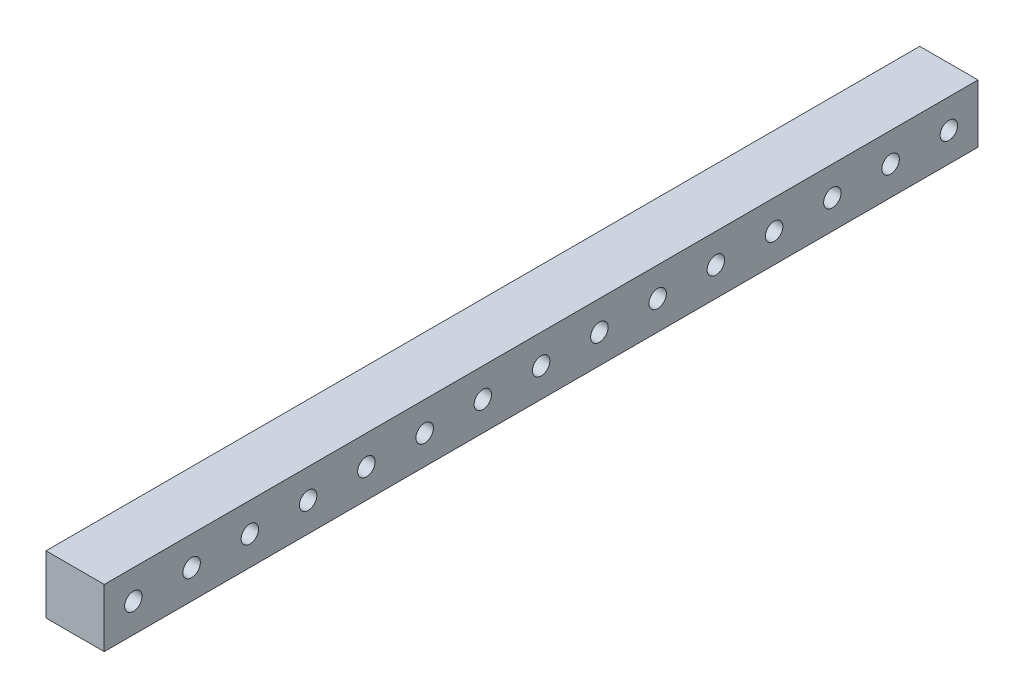
ISO-10303-21;
HEADER;
FILE_DESCRIPTION(('STEP AP214'),'2;1');
FILE_NAME('part.step','',(''),(''),'','','');
FILE_SCHEMA(('AUTOMOTIVE_DESIGN { 1 0 10303 214 1 1 1 1 }'));
ENDSEC;
DATA;
#1=APPLICATION_CONTEXT('core data for automotive mechanical design processes');
#2=APPLICATION_PROTOCOL_DEFINITION('international standard','automotive_design',2000,#1);
#3=PRODUCT_CONTEXT('',#1,'mechanical');
#4=PRODUCT('Part','Part','',(#3));
#5=PRODUCT_RELATED_PRODUCT_CATEGORY('part','',(#4));
#6=PRODUCT_DEFINITION_FORMATION('','',#4);
#7=PRODUCT_DEFINITION_CONTEXT('part definition',#1,'design');
#8=PRODUCT_DEFINITION('design','',#6,#7);
#9=PRODUCT_DEFINITION_SHAPE('','',#8);
#10=(LENGTH_UNIT() NAMED_UNIT(*) SI_UNIT(.MILLI.,.METRE.));
#11=(NAMED_UNIT(*) PLANE_ANGLE_UNIT() SI_UNIT($,.RADIAN.));
#12=(NAMED_UNIT(*) SI_UNIT($,.STERADIAN.) SOLID_ANGLE_UNIT());
#13=UNCERTAINTY_MEASURE_WITH_UNIT(LENGTH_MEASURE(1.E-05),#10,'distance_accuracy_value','');
#14=(GEOMETRIC_REPRESENTATION_CONTEXT(3) GLOBAL_UNCERTAINTY_ASSIGNED_CONTEXT((#13)) GLOBAL_UNIT_ASSIGNED_CONTEXT((#10,
#11,#12)) REPRESENTATION_CONTEXT('',''));
#15=CARTESIAN_POINT('',(0.,0.,0.));
#16=DIRECTION('',(0.,0.,1.));
#17=DIRECTION('',(1.,0.,0.));
#18=AXIS2_PLACEMENT_3D('',#15,#16,#17);
#19=CARTESIAN_POINT('',(10.,0.,290.));
#20=DIRECTION('',(1.,0.,0.));
#21=DIRECTION('',(0.,0.,-1.));
#22=AXIS2_PLACEMENT_3D('',#19,#20,#21);
#23=CYLINDRICAL_SURFACE('',#22,3.);
#24=CARTESIAN_POINT('',(-10.,0.,290.));
#25=DIRECTION('',(1.,0.,0.));
#26=DIRECTION('',(0.,0.,-1.));
#27=AXIS2_PLACEMENT_3D('',#24,#25,#26);
#28=CIRCLE('',#27,2.99999999999999);
#29=CARTESIAN_POINT('',(-10.,0.,287.));
#30=VERTEX_POINT('',#29);
#31=EDGE_CURVE('E40',#30,#30,#28,.T.);
#32=ORIENTED_EDGE('',*,*,#31,.F.);
#33=EDGE_LOOP('',(#32));
#34=FACE_BOUND('',#33,.T.);
#35=CARTESIAN_POINT('',(10.,0.,290.));
#36=DIRECTION('',(1.,0.,0.));
#37=DIRECTION('',(0.,0.,-1.));
#38=AXIS2_PLACEMENT_3D('',#35,#36,#37);
#39=CIRCLE('',#38,3.);
#40=CARTESIAN_POINT('',(10.,0.,287.));
#41=VERTEX_POINT('',#40);
#42=EDGE_CURVE('E11',#41,#41,#39,.T.);
#43=ORIENTED_EDGE('',*,*,#42,.T.);
#44=EDGE_LOOP('',(#43));
#45=FACE_BOUND('',#44,.T.);
#46=ADVANCED_FACE('F32',(#34,#45),#23,.F.);
#47=CARTESIAN_POINT('',(10.,0.,270.));
#48=DIRECTION('',(1.,0.,0.));
#49=DIRECTION('',(0.,0.,-1.));
#50=AXIS2_PLACEMENT_3D('',#47,#48,#49);
#51=CYLINDRICAL_SURFACE('',#50,3.);
#52=CARTESIAN_POINT('',(-10.,0.,270.));
#53=DIRECTION('',(1.,0.,0.));
#54=DIRECTION('',(0.,0.,-1.));
#55=AXIS2_PLACEMENT_3D('',#52,#53,#54);
#56=CIRCLE('',#55,2.99999999999999);
#57=CARTESIAN_POINT('',(-10.,0.,267.));
#58=VERTEX_POINT('',#57);
#59=EDGE_CURVE('E176',#58,#58,#56,.T.);
#60=ORIENTED_EDGE('',*,*,#59,.F.);
#61=EDGE_LOOP('',(#60));
#62=FACE_BOUND('',#61,.T.);
#63=CARTESIAN_POINT('',(10.,0.,270.));
#64=DIRECTION('',(1.,0.,0.));
#65=DIRECTION('',(0.,0.,-1.));
#66=AXIS2_PLACEMENT_3D('',#63,#64,#65);
#67=CIRCLE('',#66,3.);
#68=CARTESIAN_POINT('',(10.,0.,267.));
#69=VERTEX_POINT('',#68);
#70=EDGE_CURVE('E179',#69,#69,#67,.T.);
#71=ORIENTED_EDGE('',*,*,#70,.T.);
#72=EDGE_LOOP('',(#71));
#73=FACE_BOUND('',#72,.T.);
#74=ADVANCED_FACE('F188',(#62,#73),#51,.F.);
#75=CARTESIAN_POINT('',(10.,0.,250.));
#76=DIRECTION('',(1.,0.,0.));
#77=DIRECTION('',(0.,0.,-1.));
#78=AXIS2_PLACEMENT_3D('',#75,#76,#77);
#79=CYLINDRICAL_SURFACE('',#78,3.);
#80=CARTESIAN_POINT('',(-10.,0.,250.));
#81=DIRECTION('',(1.,0.,0.));
#82=DIRECTION('',(0.,0.,-1.));
#83=AXIS2_PLACEMENT_3D('',#80,#81,#82);
#84=CIRCLE('',#83,2.99999999999999);
#85=CARTESIAN_POINT('',(-10.,0.,247.));
#86=VERTEX_POINT('',#85);
#87=EDGE_CURVE('E170',#86,#86,#84,.T.);
#88=ORIENTED_EDGE('',*,*,#87,.F.);
#89=EDGE_LOOP('',(#88));
#90=FACE_BOUND('',#89,.T.);
#91=CARTESIAN_POINT('',(10.,0.,250.));
#92=DIRECTION('',(1.,0.,0.));
#93=DIRECTION('',(0.,0.,-1.));
#94=AXIS2_PLACEMENT_3D('',#91,#92,#93);
#95=CIRCLE('',#94,3.);
#96=CARTESIAN_POINT('',(10.,0.,247.));
#97=VERTEX_POINT('',#96);
#98=EDGE_CURVE('E173',#97,#97,#95,.T.);
#99=ORIENTED_EDGE('',*,*,#98,.T.);
#100=EDGE_LOOP('',(#99));
#101=FACE_BOUND('',#100,.T.);
#102=ADVANCED_FACE('F247',(#90,#101),#79,.F.);
#103=CARTESIAN_POINT('',(10.,0.,230.));
#104=DIRECTION('',(1.,0.,0.));
#105=DIRECTION('',(0.,0.,-1.));
#106=AXIS2_PLACEMENT_3D('',#103,#104,#105);
#107=CYLINDRICAL_SURFACE('',#106,3.);
#108=CARTESIAN_POINT('',(-10.,0.,230.));
#109=DIRECTION('',(1.,0.,0.));
#110=DIRECTION('',(0.,0.,-1.));
#111=AXIS2_PLACEMENT_3D('',#108,#109,#110);
#112=CIRCLE('',#111,2.99999999999999);
#113=CARTESIAN_POINT('',(-10.,0.,227.));
#114=VERTEX_POINT('',#113);
#115=EDGE_CURVE('E164',#114,#114,#112,.T.);
#116=ORIENTED_EDGE('',*,*,#115,.F.);
#117=EDGE_LOOP('',(#116));
#118=FACE_BOUND('',#117,.T.);
#119=CARTESIAN_POINT('',(10.,0.,230.));
#120=DIRECTION('',(1.,0.,0.));
#121=DIRECTION('',(0.,0.,-1.));
#122=AXIS2_PLACEMENT_3D('',#119,#120,#121);
#123=CIRCLE('',#122,3.);
#124=CARTESIAN_POINT('',(10.,0.,227.));
#125=VERTEX_POINT('',#124);
#126=EDGE_CURVE('E167',#125,#125,#123,.T.);
#127=ORIENTED_EDGE('',*,*,#126,.T.);
#128=EDGE_LOOP('',(#127));
#129=FACE_BOUND('',#128,.T.);
#130=ADVANCED_FACE('F243',(#118,#129),#107,.F.);
#131=CARTESIAN_POINT('',(10.,0.,210.));
#132=DIRECTION('',(1.,0.,0.));
#133=DIRECTION('',(0.,0.,-1.));
#134=AXIS2_PLACEMENT_3D('',#131,#132,#133);
#135=CYLINDRICAL_SURFACE('',#134,3.);
#136=CARTESIAN_POINT('',(-10.,0.,210.));
#137=DIRECTION('',(1.,0.,0.));
#138=DIRECTION('',(0.,0.,-1.));
#139=AXIS2_PLACEMENT_3D('',#136,#137,#138);
#140=CIRCLE('',#139,2.99999999999999);
#141=CARTESIAN_POINT('',(-10.,0.,207.));
#142=VERTEX_POINT('',#141);
#143=EDGE_CURVE('E158',#142,#142,#140,.T.);
#144=ORIENTED_EDGE('',*,*,#143,.F.);
#145=EDGE_LOOP('',(#144));
#146=FACE_BOUND('',#145,.T.);
#147=CARTESIAN_POINT('',(10.,0.,210.));
#148=DIRECTION('',(1.,0.,0.));
#149=DIRECTION('',(0.,0.,-1.));
#150=AXIS2_PLACEMENT_3D('',#147,#148,#149);
#151=CIRCLE('',#150,3.);
#152=CARTESIAN_POINT('',(10.,0.,207.));
#153=VERTEX_POINT('',#152);
#154=EDGE_CURVE('E161',#153,#153,#151,.T.);
#155=ORIENTED_EDGE('',*,*,#154,.T.);
#156=EDGE_LOOP('',(#155));
#157=FACE_BOUND('',#156,.T.);
#158=ADVANCED_FACE('F239',(#146,#157),#135,.F.);
#159=CARTESIAN_POINT('',(10.,0.,190.));
#160=DIRECTION('',(1.,0.,0.));
#161=DIRECTION('',(0.,0.,-1.));
#162=AXIS2_PLACEMENT_3D('',#159,#160,#161);
#163=CYLINDRICAL_SURFACE('',#162,3.);
#164=CARTESIAN_POINT('',(-10.,0.,190.));
#165=DIRECTION('',(1.,0.,0.));
#166=DIRECTION('',(0.,0.,-1.));
#167=AXIS2_PLACEMENT_3D('',#164,#165,#166);
#168=CIRCLE('',#167,2.99999999999999);
#169=CARTESIAN_POINT('',(-10.,0.,187.));
#170=VERTEX_POINT('',#169);
#171=EDGE_CURVE('E152',#170,#170,#168,.T.);
#172=ORIENTED_EDGE('',*,*,#171,.F.);
#173=EDGE_LOOP('',(#172));
#174=FACE_BOUND('',#173,.T.);
#175=CARTESIAN_POINT('',(10.,0.,190.));
#176=DIRECTION('',(1.,0.,0.));
#177=DIRECTION('',(0.,0.,-1.));
#178=AXIS2_PLACEMENT_3D('',#175,#176,#177);
#179=CIRCLE('',#178,3.);
#180=CARTESIAN_POINT('',(10.,0.,187.));
#181=VERTEX_POINT('',#180);
#182=EDGE_CURVE('E155',#181,#181,#179,.T.);
#183=ORIENTED_EDGE('',*,*,#182,.T.);
#184=EDGE_LOOP('',(#183));
#185=FACE_BOUND('',#184,.T.);
#186=ADVANCED_FACE('F235',(#174,#185),#163,.F.);
#187=CARTESIAN_POINT('',(10.,0.,170.));
#188=DIRECTION('',(1.,0.,0.));
#189=DIRECTION('',(0.,0.,-1.));
#190=AXIS2_PLACEMENT_3D('',#187,#188,#189);
#191=CYLINDRICAL_SURFACE('',#190,3.);
#192=CARTESIAN_POINT('',(-10.,0.,170.));
#193=DIRECTION('',(1.,0.,0.));
#194=DIRECTION('',(0.,0.,-1.));
#195=AXIS2_PLACEMENT_3D('',#192,#193,#194);
#196=CIRCLE('',#195,2.99999999999999);
#197=CARTESIAN_POINT('',(-10.,0.,167.));
#198=VERTEX_POINT('',#197);
#199=EDGE_CURVE('E146',#198,#198,#196,.T.);
#200=ORIENTED_EDGE('',*,*,#199,.F.);
#201=EDGE_LOOP('',(#200));
#202=FACE_BOUND('',#201,.T.);
#203=CARTESIAN_POINT('',(10.,0.,170.));
#204=DIRECTION('',(1.,0.,0.));
#205=DIRECTION('',(0.,0.,-1.));
#206=AXIS2_PLACEMENT_3D('',#203,#204,#205);
#207=CIRCLE('',#206,3.);
#208=CARTESIAN_POINT('',(10.,0.,167.));
#209=VERTEX_POINT('',#208);
#210=EDGE_CURVE('E149',#209,#209,#207,.T.);
#211=ORIENTED_EDGE('',*,*,#210,.T.);
#212=EDGE_LOOP('',(#211));
#213=FACE_BOUND('',#212,.T.);
#214=ADVANCED_FACE('F231',(#202,#213),#191,.F.);
#215=CARTESIAN_POINT('',(10.,0.,150.));
#216=DIRECTION('',(1.,0.,0.));
#217=DIRECTION('',(0.,0.,-1.));
#218=AXIS2_PLACEMENT_3D('',#215,#216,#217);
#219=CYLINDRICAL_SURFACE('',#218,3.);
#220=CARTESIAN_POINT('',(-10.,0.,150.));
#221=DIRECTION('',(1.,0.,0.));
#222=DIRECTION('',(0.,0.,-1.));
#223=AXIS2_PLACEMENT_3D('',#220,#221,#222);
#224=CIRCLE('',#223,2.99999999999999);
#225=CARTESIAN_POINT('',(-10.,0.,147.));
#226=VERTEX_POINT('',#225);
#227=EDGE_CURVE('E140',#226,#226,#224,.T.);
#228=ORIENTED_EDGE('',*,*,#227,.F.);
#229=EDGE_LOOP('',(#228));
#230=FACE_BOUND('',#229,.T.);
#231=CARTESIAN_POINT('',(10.,0.,150.));
#232=DIRECTION('',(1.,0.,0.));
#233=DIRECTION('',(0.,0.,-1.));
#234=AXIS2_PLACEMENT_3D('',#231,#232,#233);
#235=CIRCLE('',#234,3.);
#236=CARTESIAN_POINT('',(10.,0.,147.));
#237=VERTEX_POINT('',#236);
#238=EDGE_CURVE('E143',#237,#237,#235,.T.);
#239=ORIENTED_EDGE('',*,*,#238,.T.);
#240=EDGE_LOOP('',(#239));
#241=FACE_BOUND('',#240,.T.);
#242=ADVANCED_FACE('F227',(#230,#241),#219,.F.);
#243=CARTESIAN_POINT('',(10.,0.,130.));
#244=DIRECTION('',(1.,0.,0.));
#245=DIRECTION('',(0.,0.,-1.));
#246=AXIS2_PLACEMENT_3D('',#243,#244,#245);
#247=CYLINDRICAL_SURFACE('',#246,3.);
#248=CARTESIAN_POINT('',(-10.,0.,130.));
#249=DIRECTION('',(1.,0.,0.));
#250=DIRECTION('',(0.,0.,-1.));
#251=AXIS2_PLACEMENT_3D('',#248,#249,#250);
#252=CIRCLE('',#251,2.99999999999999);
#253=CARTESIAN_POINT('',(-10.,0.,127.));
#254=VERTEX_POINT('',#253);
#255=EDGE_CURVE('E134',#254,#254,#252,.T.);
#256=ORIENTED_EDGE('',*,*,#255,.F.);
#257=EDGE_LOOP('',(#256));
#258=FACE_BOUND('',#257,.T.);
#259=CARTESIAN_POINT('',(10.,0.,130.));
#260=DIRECTION('',(1.,0.,0.));
#261=DIRECTION('',(0.,0.,-1.));
#262=AXIS2_PLACEMENT_3D('',#259,#260,#261);
#263=CIRCLE('',#262,3.);
#264=CARTESIAN_POINT('',(10.,0.,127.));
#265=VERTEX_POINT('',#264);
#266=EDGE_CURVE('E137',#265,#265,#263,.T.);
#267=ORIENTED_EDGE('',*,*,#266,.T.);
#268=EDGE_LOOP('',(#267));
#269=FACE_BOUND('',#268,.T.);
#270=ADVANCED_FACE('F223',(#258,#269),#247,.F.);
#271=CARTESIAN_POINT('',(10.,0.,110.));
#272=DIRECTION('',(1.,0.,0.));
#273=DIRECTION('',(0.,0.,-1.));
#274=AXIS2_PLACEMENT_3D('',#271,#272,#273);
#275=CYLINDRICAL_SURFACE('',#274,3.);
#276=CARTESIAN_POINT('',(-10.,0.,110.));
#277=DIRECTION('',(1.,0.,0.));
#278=DIRECTION('',(0.,0.,-1.));
#279=AXIS2_PLACEMENT_3D('',#276,#277,#278);
#280=CIRCLE('',#279,2.99999999999999);
#281=CARTESIAN_POINT('',(-10.,0.,107.));
#282=VERTEX_POINT('',#281);
#283=EDGE_CURVE('E128',#282,#282,#280,.T.);
#284=ORIENTED_EDGE('',*,*,#283,.F.);
#285=EDGE_LOOP('',(#284));
#286=FACE_BOUND('',#285,.T.);
#287=CARTESIAN_POINT('',(10.,0.,110.));
#288=DIRECTION('',(1.,0.,0.));
#289=DIRECTION('',(0.,0.,-1.));
#290=AXIS2_PLACEMENT_3D('',#287,#288,#289);
#291=CIRCLE('',#290,3.);
#292=CARTESIAN_POINT('',(10.,0.,107.));
#293=VERTEX_POINT('',#292);
#294=EDGE_CURVE('E131',#293,#293,#291,.T.);
#295=ORIENTED_EDGE('',*,*,#294,.T.);
#296=EDGE_LOOP('',(#295));
#297=FACE_BOUND('',#296,.T.);
#298=ADVANCED_FACE('F219',(#286,#297),#275,.F.);
#299=CARTESIAN_POINT('',(10.,0.,90.));
#300=DIRECTION('',(1.,0.,0.));
#301=DIRECTION('',(0.,0.,-1.));
#302=AXIS2_PLACEMENT_3D('',#299,#300,#301);
#303=CYLINDRICAL_SURFACE('',#302,3.);
#304=CARTESIAN_POINT('',(-10.,0.,90.));
#305=DIRECTION('',(1.,0.,0.));
#306=DIRECTION('',(0.,0.,-1.));
#307=AXIS2_PLACEMENT_3D('',#304,#305,#306);
#308=CIRCLE('',#307,2.99999999999999);
#309=CARTESIAN_POINT('',(-10.,0.,87.));
#310=VERTEX_POINT('',#309);
#311=EDGE_CURVE('E122',#310,#310,#308,.T.);
#312=ORIENTED_EDGE('',*,*,#311,.F.);
#313=EDGE_LOOP('',(#312));
#314=FACE_BOUND('',#313,.T.);
#315=CARTESIAN_POINT('',(10.,0.,90.));
#316=DIRECTION('',(1.,0.,0.));
#317=DIRECTION('',(0.,0.,-1.));
#318=AXIS2_PLACEMENT_3D('',#315,#316,#317);
#319=CIRCLE('',#318,3.);
#320=CARTESIAN_POINT('',(10.,0.,87.));
#321=VERTEX_POINT('',#320);
#322=EDGE_CURVE('E125',#321,#321,#319,.T.);
#323=ORIENTED_EDGE('',*,*,#322,.T.);
#324=EDGE_LOOP('',(#323));
#325=FACE_BOUND('',#324,.T.);
#326=ADVANCED_FACE('F215',(#314,#325),#303,.F.);
#327=CARTESIAN_POINT('',(10.,0.,70.));
#328=DIRECTION('',(1.,0.,0.));
#329=DIRECTION('',(0.,0.,-1.));
#330=AXIS2_PLACEMENT_3D('',#327,#328,#329);
#331=CYLINDRICAL_SURFACE('',#330,3.);
#332=CARTESIAN_POINT('',(-10.,0.,70.));
#333=DIRECTION('',(1.,0.,0.));
#334=DIRECTION('',(0.,0.,-1.));
#335=AXIS2_PLACEMENT_3D('',#332,#333,#334);
#336=CIRCLE('',#335,2.99999999999999);
#337=CARTESIAN_POINT('',(-10.,0.,67.));
#338=VERTEX_POINT('',#337);
#339=EDGE_CURVE('E116',#338,#338,#336,.T.);
#340=ORIENTED_EDGE('',*,*,#339,.F.);
#341=EDGE_LOOP('',(#340));
#342=FACE_BOUND('',#341,.T.);
#343=CARTESIAN_POINT('',(10.,0.,70.));
#344=DIRECTION('',(1.,0.,0.));
#345=DIRECTION('',(0.,0.,-1.));
#346=AXIS2_PLACEMENT_3D('',#343,#344,#345);
#347=CIRCLE('',#346,3.);
#348=CARTESIAN_POINT('',(10.,0.,67.));
#349=VERTEX_POINT('',#348);
#350=EDGE_CURVE('E119',#349,#349,#347,.T.);
#351=ORIENTED_EDGE('',*,*,#350,.T.);
#352=EDGE_LOOP('',(#351));
#353=FACE_BOUND('',#352,.T.);
#354=ADVANCED_FACE('F211',(#342,#353),#331,.F.);
#355=CARTESIAN_POINT('',(10.,0.,50.));
#356=DIRECTION('',(1.,0.,0.));
#357=DIRECTION('',(0.,0.,-1.));
#358=AXIS2_PLACEMENT_3D('',#355,#356,#357);
#359=CYLINDRICAL_SURFACE('',#358,3.);
#360=CARTESIAN_POINT('',(-10.,0.,50.));
#361=DIRECTION('',(1.,0.,0.));
#362=DIRECTION('',(0.,0.,-1.));
#363=AXIS2_PLACEMENT_3D('',#360,#361,#362);
#364=CIRCLE('',#363,2.99999999999999);
#365=CARTESIAN_POINT('',(-10.,0.,47.));
#366=VERTEX_POINT('',#365);
#367=EDGE_CURVE('E110',#366,#366,#364,.T.);
#368=ORIENTED_EDGE('',*,*,#367,.F.);
#369=EDGE_LOOP('',(#368));
#370=FACE_BOUND('',#369,.T.);
#371=CARTESIAN_POINT('',(10.,0.,50.));
#372=DIRECTION('',(1.,0.,0.));
#373=DIRECTION('',(0.,0.,-1.));
#374=AXIS2_PLACEMENT_3D('',#371,#372,#373);
#375=CIRCLE('',#374,3.);
#376=CARTESIAN_POINT('',(10.,0.,47.));
#377=VERTEX_POINT('',#376);
#378=EDGE_CURVE('E113',#377,#377,#375,.T.);
#379=ORIENTED_EDGE('',*,*,#378,.T.);
#380=EDGE_LOOP('',(#379));
#381=FACE_BOUND('',#380,.T.);
#382=ADVANCED_FACE('F207',(#370,#381),#359,.F.);
#383=CARTESIAN_POINT('',(-10.,10.0000000000001,300.));
#384=DIRECTION('',(1.,0.,0.));
#385=DIRECTION('',(0.,1.,0.));
#386=AXIS2_PLACEMENT_3D('',#383,#384,#385);
#387=PLANE('',#386);
#388=CARTESIAN_POINT('',(-10.,0.,30.));
#389=DIRECTION('',(1.,0.,0.));
#390=DIRECTION('',(0.,0.,-1.));
#391=AXIS2_PLACEMENT_3D('',#388,#389,#390);
#392=CIRCLE('',#391,2.99999999999999);
#393=CARTESIAN_POINT('',(-10.,0.,27.));
#394=VERTEX_POINT('',#393);
#395=EDGE_CURVE('E396',#394,#394,#392,.T.);
#396=ORIENTED_EDGE('',*,*,#395,.T.);
#397=EDGE_LOOP('',(#396));
#398=FACE_BOUND('',#397,.T.);
#399=CARTESIAN_POINT('',(-10.,0.,10.));
#400=DIRECTION('',(1.,0.,0.));
#401=DIRECTION('',(0.,0.,-1.));
#402=AXIS2_PLACEMENT_3D('',#399,#400,#401);
#403=CIRCLE('',#402,2.99999999999999);
#404=CARTESIAN_POINT('',(-10.,0.,7.00000000000001));
#405=VERTEX_POINT('',#404);
#406=EDGE_CURVE('E103',#405,#405,#403,.T.);
#407=ORIENTED_EDGE('',*,*,#406,.T.);
#408=EDGE_LOOP('',(#407));
#409=FACE_BOUND('',#408,.T.);
#410=DIRECTION('',(0.,-1.,0.));
#411=VECTOR('',#410,1.);
#412=CARTESIAN_POINT('',(-10.,10.0000000000001,0.));
#413=LINE('',#412,#411);
#414=CARTESIAN_POINT('',(-10.,10.0000000000001,0.));
#415=VERTEX_POINT('',#414);
#416=CARTESIAN_POINT('',(-10.,-10.0000000000001,0.));
#417=VERTEX_POINT('',#416);
#418=EDGE_CURVE('E100',#415,#417,#413,.T.);
#419=ORIENTED_EDGE('',*,*,#418,.T.);
#420=DIRECTION('',(0.,0.,-1.));
#421=VECTOR('',#420,1.);
#422=CARTESIAN_POINT('',(-10.,-10.0000000000001,300.));
#423=LINE('',#422,#421);
#424=CARTESIAN_POINT('',(-10.,-10.0000000000001,300.));
#425=VERTEX_POINT('',#424);
#426=EDGE_CURVE('E90',#425,#417,#423,.T.);
#427=ORIENTED_EDGE('',*,*,#426,.F.);
#428=DIRECTION('',(0.,-1.,0.));
#429=VECTOR('',#428,1.);
#430=CARTESIAN_POINT('',(-10.,10.0000000000001,300.));
#431=LINE('',#430,#429);
#432=CARTESIAN_POINT('',(-10.,10.0000000000001,300.));
#433=VERTEX_POINT('',#432);
#434=EDGE_CURVE('E84',#433,#425,#431,.T.);
#435=ORIENTED_EDGE('',*,*,#434,.F.);
#436=DIRECTION('',(0.,0.,-1.));
#437=VECTOR('',#436,1.);
#438=CARTESIAN_POINT('',(-10.,10.0000000000001,300.));
#439=LINE('',#438,#437);
#440=EDGE_CURVE('E96',#433,#415,#439,.T.);
#441=ORIENTED_EDGE('',*,*,#440,.T.);
#442=EDGE_LOOP('',(#419,#427,#435,#441));
#443=FACE_BOUND('',#442,.T.);
#444=ORIENTED_EDGE('',*,*,#367,.T.);
#445=EDGE_LOOP('',(#444));
#446=FACE_BOUND('',#445,.T.);
#447=ORIENTED_EDGE('',*,*,#339,.T.);
#448=EDGE_LOOP('',(#447));
#449=FACE_BOUND('',#448,.T.);
#450=ORIENTED_EDGE('',*,*,#311,.T.);
#451=EDGE_LOOP('',(#450));
#452=FACE_BOUND('',#451,.T.);
#453=ORIENTED_EDGE('',*,*,#283,.T.);
#454=EDGE_LOOP('',(#453));
#455=FACE_BOUND('',#454,.T.);
#456=ORIENTED_EDGE('',*,*,#255,.T.);
#457=EDGE_LOOP('',(#456));
#458=FACE_BOUND('',#457,.T.);
#459=ORIENTED_EDGE('',*,*,#227,.T.);
#460=EDGE_LOOP('',(#459));
#461=FACE_BOUND('',#460,.T.);
#462=ORIENTED_EDGE('',*,*,#199,.T.);
#463=EDGE_LOOP('',(#462));
#464=FACE_BOUND('',#463,.T.);
#465=ORIENTED_EDGE('',*,*,#171,.T.);
#466=EDGE_LOOP('',(#465));
#467=FACE_BOUND('',#466,.T.);
#468=ORIENTED_EDGE('',*,*,#143,.T.);
#469=EDGE_LOOP('',(#468));
#470=FACE_BOUND('',#469,.T.);
#471=ORIENTED_EDGE('',*,*,#115,.T.);
#472=EDGE_LOOP('',(#471));
#473=FACE_BOUND('',#472,.T.);
#474=ORIENTED_EDGE('',*,*,#87,.T.);
#475=EDGE_LOOP('',(#474));
#476=FACE_BOUND('',#475,.T.);
#477=ORIENTED_EDGE('',*,*,#59,.T.);
#478=EDGE_LOOP('',(#477));
#479=FACE_BOUND('',#478,.T.);
#480=ORIENTED_EDGE('',*,*,#31,.T.);
#481=EDGE_LOOP('',(#480));
#482=FACE_BOUND('',#481,.T.);
#483=ADVANCED_FACE('F184',(#398,#409,#443,#446,#449,#452,#455,#458,#461,#464,#467,#470,#473,
#476,#479,#482),#387,.F.);
#484=CARTESIAN_POINT('',(-10.,-10.0000000000001,300.));
#485=DIRECTION('',(0.,1.,0.));
#486=DIRECTION('',(0.,0.,1.));
#487=AXIS2_PLACEMENT_3D('',#484,#485,#486);
#488=PLANE('',#487);
#489=DIRECTION('',(1.,0.,0.));
#490=VECTOR('',#489,1.);
#491=CARTESIAN_POINT('',(-10.,-10.0000000000001,0.));
#492=LINE('',#491,#490);
#493=CARTESIAN_POINT('',(10.,-10.0000000000001,0.));
#494=VERTEX_POINT('',#493);
#495=EDGE_CURVE('E89',#417,#494,#492,.T.);
#496=ORIENTED_EDGE('',*,*,#495,.T.);
#497=DIRECTION('',(0.,0.,-1.));
#498=VECTOR('',#497,1.);
#499=CARTESIAN_POINT('',(10.,-10.0000000000001,300.));
#500=LINE('',#499,#498);
#501=CARTESIAN_POINT('',(10.,-10.0000000000001,300.));
#502=VERTEX_POINT('',#501);
#503=EDGE_CURVE('E87',#502,#494,#500,.T.);
#504=ORIENTED_EDGE('',*,*,#503,.F.);
#505=DIRECTION('',(1.,0.,0.));
#506=VECTOR('',#505,1.);
#507=CARTESIAN_POINT('',(-10.,-10.0000000000001,300.));
#508=LINE('',#507,#506);
#509=EDGE_CURVE('E79',#425,#502,#508,.T.);
#510=ORIENTED_EDGE('',*,*,#509,.F.);
#511=ORIENTED_EDGE('',*,*,#426,.T.);
#512=EDGE_LOOP('',(#496,#504,#510,#511));
#513=FACE_BOUND('',#512,.T.);
#514=ADVANCED_FACE('F88',(#513),#488,.F.);
#515=CARTESIAN_POINT('',(10.,10.0000000000001,300.));
#516=DIRECTION('',(-1.,0.,0.));
#517=DIRECTION('',(0.,-1.,0.));
#518=AXIS2_PLACEMENT_3D('',#515,#516,#517);
#519=PLANE('',#518);
#520=CARTESIAN_POINT('',(10.,0.,30.));
#521=DIRECTION('',(1.,0.,0.));
#522=DIRECTION('',(0.,0.,-1.));
#523=AXIS2_PLACEMENT_3D('',#520,#521,#522);
#524=CIRCLE('',#523,3.);
#525=CARTESIAN_POINT('',(10.,0.,27.));
#526=VERTEX_POINT('',#525);
#527=EDGE_CURVE('E398',#526,#526,#524,.T.);
#528=ORIENTED_EDGE('',*,*,#527,.F.);
#529=EDGE_LOOP('',(#528));
#530=FACE_BOUND('',#529,.T.);
#531=CARTESIAN_POINT('',(10.,0.,10.));
#532=DIRECTION('',(1.,0.,0.));
#533=DIRECTION('',(0.,0.,-1.));
#534=AXIS2_PLACEMENT_3D('',#531,#532,#533);
#535=CIRCLE('',#534,3.);
#536=CARTESIAN_POINT('',(10.,0.,7.));
#537=VERTEX_POINT('',#536);
#538=EDGE_CURVE('E399',#537,#537,#535,.T.);
#539=ORIENTED_EDGE('',*,*,#538,.F.);
#540=EDGE_LOOP('',(#539));
#541=FACE_BOUND('',#540,.T.);
#542=DIRECTION('',(0.,1.,0.));
#543=VECTOR('',#542,1.);
#544=CARTESIAN_POINT('',(10.,10.0000000000001,0.));
#545=LINE('',#544,#543);
#546=CARTESIAN_POINT('',(10.,10.0000000000001,0.));
#547=VERTEX_POINT('',#546);
#548=EDGE_CURVE('E65',#494,#547,#545,.T.);
#549=ORIENTED_EDGE('',*,*,#548,.T.);
#550=DIRECTION('',(0.,0.,-1.));
#551=VECTOR('',#550,1.);
#552=CARTESIAN_POINT('',(10.,10.0000000000001,300.));
#553=LINE('',#552,#551);
#554=CARTESIAN_POINT('',(10.,10.0000000000001,300.));
#555=VERTEX_POINT('',#554);
#556=EDGE_CURVE('E91',#555,#547,#553,.T.);
#557=ORIENTED_EDGE('',*,*,#556,.F.);
#558=DIRECTION('',(0.,1.,0.));
#559=VECTOR('',#558,1.);
#560=CARTESIAN_POINT('',(10.,10.0000000000001,300.));
#561=LINE('',#560,#559);
#562=EDGE_CURVE('E82',#502,#555,#561,.T.);
#563=ORIENTED_EDGE('',*,*,#562,.F.);
#564=ORIENTED_EDGE('',*,*,#503,.T.);
#565=EDGE_LOOP('',(#549,#557,#563,#564));
#566=FACE_BOUND('',#565,.T.);
#567=ORIENTED_EDGE('',*,*,#378,.F.);
#568=EDGE_LOOP('',(#567));
#569=FACE_BOUND('',#568,.T.);
#570=ORIENTED_EDGE('',*,*,#350,.F.);
#571=EDGE_LOOP('',(#570));
#572=FACE_BOUND('',#571,.T.);
#573=ORIENTED_EDGE('',*,*,#322,.F.);
#574=EDGE_LOOP('',(#573));
#575=FACE_BOUND('',#574,.T.);
#576=ORIENTED_EDGE('',*,*,#294,.F.);
#577=EDGE_LOOP('',(#576));
#578=FACE_BOUND('',#577,.T.);
#579=ORIENTED_EDGE('',*,*,#266,.F.);
#580=EDGE_LOOP('',(#579));
#581=FACE_BOUND('',#580,.T.);
#582=ORIENTED_EDGE('',*,*,#238,.F.);
#583=EDGE_LOOP('',(#582));
#584=FACE_BOUND('',#583,.T.);
#585=ORIENTED_EDGE('',*,*,#210,.F.);
#586=EDGE_LOOP('',(#585));
#587=FACE_BOUND('',#586,.T.);
#588=ORIENTED_EDGE('',*,*,#182,.F.);
#589=EDGE_LOOP('',(#588));
#590=FACE_BOUND('',#589,.T.);
#591=ORIENTED_EDGE('',*,*,#154,.F.);
#592=EDGE_LOOP('',(#591));
#593=FACE_BOUND('',#592,.T.);
#594=ORIENTED_EDGE('',*,*,#126,.F.);
#595=EDGE_LOOP('',(#594));
#596=FACE_BOUND('',#595,.T.);
#597=ORIENTED_EDGE('',*,*,#98,.F.);
#598=EDGE_LOOP('',(#597));
#599=FACE_BOUND('',#598,.T.);
#600=ORIENTED_EDGE('',*,*,#70,.F.);
#601=EDGE_LOOP('',(#600));
#602=FACE_BOUND('',#601,.T.);
#603=ORIENTED_EDGE('',*,*,#42,.F.);
#604=EDGE_LOOP('',(#603));
#605=FACE_BOUND('',#604,.T.);
#606=ADVANCED_FACE('F93',(#530,#541,#566,#569,#572,#575,#578,#581,#584,#587,#590,#593,#596,#599,
#602,#605),#519,.F.);
#607=CARTESIAN_POINT('',(-10.,10.0000000000001,300.));
#608=DIRECTION('',(0.,-1.,0.));
#609=DIRECTION('',(0.,0.,-1.));
#610=AXIS2_PLACEMENT_3D('',#607,#608,#609);
#611=PLANE('',#610);
#612=DIRECTION('',(-1.,0.,0.));
#613=VECTOR('',#612,1.);
#614=CARTESIAN_POINT('',(-10.,10.0000000000001,0.));
#615=LINE('',#614,#613);
#616=EDGE_CURVE('E71',#547,#415,#615,.T.);
#617=ORIENTED_EDGE('',*,*,#616,.T.);
#618=ORIENTED_EDGE('',*,*,#440,.F.);
#619=DIRECTION('',(-1.,0.,0.));
#620=VECTOR('',#619,1.);
#621=CARTESIAN_POINT('',(-10.,10.0000000000001,300.));
#622=LINE('',#621,#620);
#623=EDGE_CURVE('E48',#555,#433,#622,.T.);
#624=ORIENTED_EDGE('',*,*,#623,.F.);
#625=ORIENTED_EDGE('',*,*,#556,.T.);
#626=EDGE_LOOP('',(#617,#618,#624,#625));
#627=FACE_BOUND('',#626,.T.);
#628=ADVANCED_FACE('F192',(#627),#611,.F.);
#629=CARTESIAN_POINT('',(0.,0.,300.));
#630=DIRECTION('',(0.,0.,1.));
#631=DIRECTION('',(1.,0.,0.));
#632=AXIS2_PLACEMENT_3D('',#629,#630,#631);
#633=PLANE('',#632);
#634=ORIENTED_EDGE('',*,*,#434,.T.);
#635=ORIENTED_EDGE('',*,*,#509,.T.);
#636=ORIENTED_EDGE('',*,*,#562,.T.);
#637=ORIENTED_EDGE('',*,*,#623,.T.);
#638=EDGE_LOOP('',(#634,#635,#636,#637));
#639=FACE_BOUND('',#638,.T.);
#640=ADVANCED_FACE('F80',(#639),#633,.T.);
#641=CARTESIAN_POINT('',(0.,0.,0.));
#642=DIRECTION('',(0.,0.,1.));
#643=DIRECTION('',(1.,0.,0.));
#644=AXIS2_PLACEMENT_3D('',#641,#642,#643);
#645=PLANE('',#644);
#646=ORIENTED_EDGE('',*,*,#418,.F.);
#647=ORIENTED_EDGE('',*,*,#616,.F.);
#648=ORIENTED_EDGE('',*,*,#548,.F.);
#649=ORIENTED_EDGE('',*,*,#495,.F.);
#650=EDGE_LOOP('',(#646,#647,#648,#649));
#651=FACE_BOUND('',#650,.T.);
#652=ADVANCED_FACE('F330',(#651),#645,.F.);
#653=CARTESIAN_POINT('',(10.,0.,10.));
#654=DIRECTION('',(1.,0.,0.));
#655=DIRECTION('',(0.,0.,-1.));
#656=AXIS2_PLACEMENT_3D('',#653,#654,#655);
#657=CYLINDRICAL_SURFACE('',#656,3.);
#658=ORIENTED_EDGE('',*,*,#406,.F.);
#659=EDGE_LOOP('',(#658));
#660=FACE_BOUND('',#659,.T.);
#661=ORIENTED_EDGE('',*,*,#538,.T.);
#662=EDGE_LOOP('',(#661));
#663=FACE_BOUND('',#662,.T.);
#664=ADVANCED_FACE('F339',(#660,#663),#657,.F.);
#665=CARTESIAN_POINT('',(10.,0.,30.));
#666=DIRECTION('',(1.,0.,0.));
#667=DIRECTION('',(0.,0.,-1.));
#668=AXIS2_PLACEMENT_3D('',#665,#666,#667);
#669=CYLINDRICAL_SURFACE('',#668,3.);
#670=ORIENTED_EDGE('',*,*,#395,.F.);
#671=EDGE_LOOP('',(#670));
#672=FACE_BOUND('',#671,.T.);
#673=ORIENTED_EDGE('',*,*,#527,.T.);
#674=EDGE_LOOP('',(#673));
#675=FACE_BOUND('',#674,.T.);
#676=ADVANCED_FACE('F347',(#672,#675),#669,.F.);
#677=CLOSED_SHELL('',(#46,#74,#102,#130,#158,#186,#214,#242,#270,#298,#326,#354,#382,#483,#514,
#606,#628,#640,#652,#664,#676));
#678=MANIFOLD_SOLID_BREP('B2',#677);
#679=ADVANCED_BREP_SHAPE_REPRESENTATION('',(#18,#678),#14);
#680=SHAPE_DEFINITION_REPRESENTATION(#9,#679);
ENDSEC;
END-ISO-10303-21;
